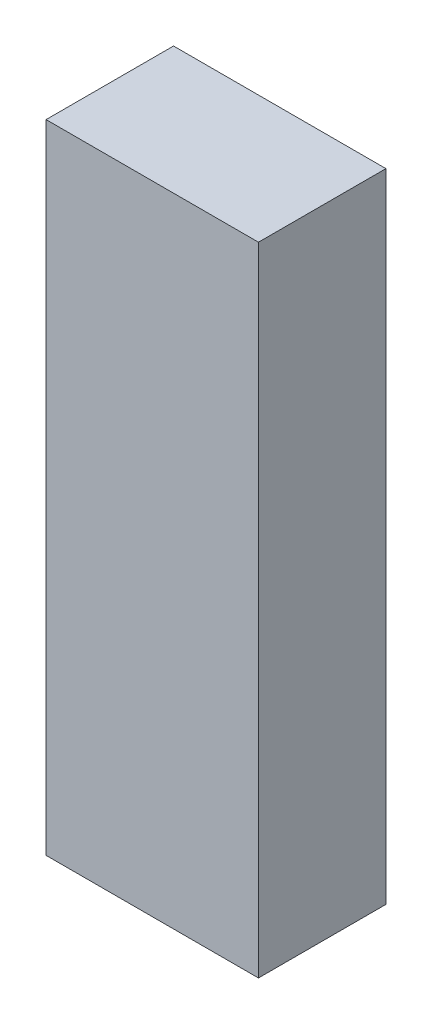
ISO-10303-21;
HEADER;
FILE_DESCRIPTION(('STEP AP214'),'2;1');
FILE_NAME('part.step','',(''),(''),'','','');
FILE_SCHEMA(('AUTOMOTIVE_DESIGN { 1 0 10303 214 1 1 1 1 }'));
ENDSEC;
DATA;
#1=APPLICATION_CONTEXT('core data for automotive mechanical design processes');
#2=APPLICATION_PROTOCOL_DEFINITION('international standard','automotive_design',2000,#1);
#3=PRODUCT_CONTEXT('',#1,'mechanical');
#4=PRODUCT('Part','Part','',(#3));
#5=PRODUCT_RELATED_PRODUCT_CATEGORY('part','',(#4));
#6=PRODUCT_DEFINITION_FORMATION('','',#4);
#7=PRODUCT_DEFINITION_CONTEXT('part definition',#1,'design');
#8=PRODUCT_DEFINITION('design','',#6,#7);
#9=PRODUCT_DEFINITION_SHAPE('','',#8);
#10=(LENGTH_UNIT() NAMED_UNIT(*) SI_UNIT(.MILLI.,.METRE.));
#11=(NAMED_UNIT(*) PLANE_ANGLE_UNIT() SI_UNIT($,.RADIAN.));
#12=(NAMED_UNIT(*) SI_UNIT($,.STERADIAN.) SOLID_ANGLE_UNIT());
#13=UNCERTAINTY_MEASURE_WITH_UNIT(LENGTH_MEASURE(1.E-05),#10,'distance_accuracy_value','');
#14=(GEOMETRIC_REPRESENTATION_CONTEXT(3) GLOBAL_UNCERTAINTY_ASSIGNED_CONTEXT((#13)) GLOBAL_UNIT_ASSIGNED_CONTEXT((#10,
#11,#12)) REPRESENTATION_CONTEXT('',''));
#15=CARTESIAN_POINT('',(0.,0.,0.));
#16=DIRECTION('',(0.,0.,1.));
#17=DIRECTION('',(1.,0.,0.));
#18=AXIS2_PLACEMENT_3D('',#15,#16,#17);
#19=CARTESIAN_POINT('',(2.49949208,-7.4994897,3.));
#20=DIRECTION('',(0.,0.,-1.));
#21=DIRECTION('',(-1.,0.,0.));
#22=AXIS2_PLACEMENT_3D('',#19,#20,#21);
#23=PLANE('',#22);
#24=DIRECTION('',(1.,0.,0.));
#25=VECTOR('',#24,1.);
#26=CARTESIAN_POINT('',(2.49949208,7.49949224,3.));
#27=LINE('',#26,#25);
#28=CARTESIAN_POINT('',(2.49949208,7.49949224,3.));
#29=VERTEX_POINT('',#28);
#30=CARTESIAN_POINT('',(-2.49949208,7.49949224,3.));
#31=VERTEX_POINT('',#30);
#32=EDGE_CURVE('E79',#29,#31,#27,.F.);
#33=ORIENTED_EDGE('',*,*,#32,.T.);
#34=DIRECTION('',(0.,1.,0.));
#35=VECTOR('',#34,1.);
#36=CARTESIAN_POINT('',(-2.49949208,7.49949224,3.));
#37=LINE('',#36,#35);
#38=CARTESIAN_POINT('',(-2.49949208,-7.4994897,3.));
#39=VERTEX_POINT('',#38);
#40=EDGE_CURVE('E55',#31,#39,#37,.F.);
#41=ORIENTED_EDGE('',*,*,#40,.T.);
#42=DIRECTION('',(1.,0.,0.));
#43=VECTOR('',#42,1.);
#44=CARTESIAN_POINT('',(-2.49949208,-7.4994897,3.));
#45=LINE('',#44,#43);
#46=CARTESIAN_POINT('',(2.49949208,-7.4994897,3.));
#47=VERTEX_POINT('',#46);
#48=EDGE_CURVE('E57',#39,#47,#45,.T.);
#49=ORIENTED_EDGE('',*,*,#48,.T.);
#50=DIRECTION('',(0.,1.,0.));
#51=VECTOR('',#50,1.);
#52=CARTESIAN_POINT('',(2.49949208,-7.4994897,3.));
#53=LINE('',#52,#51);
#54=EDGE_CURVE('E20',#47,#29,#53,.T.);
#55=ORIENTED_EDGE('',*,*,#54,.T.);
#56=EDGE_LOOP('',(#33,#41,#49,#55));
#57=FACE_BOUND('',#56,.T.);
#58=ADVANCED_FACE('F17',(#57),#23,.F.);
#59=CARTESIAN_POINT('',(2.49949208,-7.4994897,0.));
#60=DIRECTION('',(-1.,0.,0.));
#61=DIRECTION('',(0.,0.,1.));
#62=AXIS2_PLACEMENT_3D('',#59,#60,#61);
#63=PLANE('',#62);
#64=DIRECTION('',(0.,1.,0.));
#65=VECTOR('',#64,1.);
#66=CARTESIAN_POINT('',(2.49949208,-7.4994897,0.));
#67=LINE('',#66,#65);
#68=CARTESIAN_POINT('',(2.49949208,7.49949224,0.));
#69=VERTEX_POINT('',#68);
#70=CARTESIAN_POINT('',(2.49949208,-7.4994897,0.));
#71=VERTEX_POINT('',#70);
#72=EDGE_CURVE('E83',#69,#71,#67,.F.);
#73=ORIENTED_EDGE('',*,*,#72,.F.);
#74=DIRECTION('',(0.,0.,-1.));
#75=VECTOR('',#74,1.);
#76=CARTESIAN_POINT('',(2.49949208,7.49949224,0.));
#77=LINE('',#76,#75);
#78=EDGE_CURVE('E68',#69,#29,#77,.F.);
#79=ORIENTED_EDGE('',*,*,#78,.T.);
#80=ORIENTED_EDGE('',*,*,#54,.F.);
#81=DIRECTION('',(0.,0.,1.));
#82=VECTOR('',#81,1.);
#83=CARTESIAN_POINT('',(2.49949208,-7.4994897,0.));
#84=LINE('',#83,#82);
#85=EDGE_CURVE('E63',#47,#71,#84,.F.);
#86=ORIENTED_EDGE('',*,*,#85,.T.);
#87=EDGE_LOOP('',(#73,#79,#80,#86));
#88=FACE_BOUND('',#87,.T.);
#89=ADVANCED_FACE('F65',(#88),#63,.F.);
#90=CARTESIAN_POINT('',(-2.49949208,-7.4994897,0.));
#91=DIRECTION('',(0.,1.,0.));
#92=DIRECTION('',(0.,0.,1.));
#93=AXIS2_PLACEMENT_3D('',#90,#91,#92);
#94=PLANE('',#93);
#95=DIRECTION('',(-1.,0.,0.));
#96=VECTOR('',#95,1.);
#97=CARTESIAN_POINT('',(2.49949208,-7.4994897,0.));
#98=LINE('',#97,#96);
#99=CARTESIAN_POINT('',(-2.49949208,-7.4994897,0.));
#100=VERTEX_POINT('',#99);
#101=EDGE_CURVE('E72',#71,#100,#98,.T.);
#102=ORIENTED_EDGE('',*,*,#101,.F.);
#103=ORIENTED_EDGE('',*,*,#85,.F.);
#104=ORIENTED_EDGE('',*,*,#48,.F.);
#105=DIRECTION('',(0.,0.,-1.));
#106=VECTOR('',#105,1.);
#107=CARTESIAN_POINT('',(-2.49949208,-7.4994897,0.));
#108=LINE('',#107,#106);
#109=EDGE_CURVE('E75',#39,#100,#108,.T.);
#110=ORIENTED_EDGE('',*,*,#109,.T.);
#111=EDGE_LOOP('',(#102,#103,#104,#110));
#112=FACE_BOUND('',#111,.T.);
#113=ADVANCED_FACE('F70',(#112),#94,.F.);
#114=CARTESIAN_POINT('',(-2.49949208,7.49949224,0.));
#115=DIRECTION('',(1.,0.,0.));
#116=DIRECTION('',(0.,0.,-1.));
#117=AXIS2_PLACEMENT_3D('',#114,#115,#116);
#118=PLANE('',#117);
#119=DIRECTION('',(0.,1.,0.));
#120=VECTOR('',#119,1.);
#121=CARTESIAN_POINT('',(-2.49949208,-7.4994897,0.));
#122=LINE('',#121,#120);
#123=CARTESIAN_POINT('',(-2.49949208,7.49949224,0.));
#124=VERTEX_POINT('',#123);
#125=EDGE_CURVE('E26',#100,#124,#122,.T.);
#126=ORIENTED_EDGE('',*,*,#125,.F.);
#127=ORIENTED_EDGE('',*,*,#109,.F.);
#128=ORIENTED_EDGE('',*,*,#40,.F.);
#129=DIRECTION('',(0.,0.,-1.));
#130=VECTOR('',#129,1.);
#131=CARTESIAN_POINT('',(-2.49949208,7.49949224,0.));
#132=LINE('',#131,#130);
#133=EDGE_CURVE('E35',#31,#124,#132,.T.);
#134=ORIENTED_EDGE('',*,*,#133,.T.);
#135=EDGE_LOOP('',(#126,#127,#128,#134));
#136=FACE_BOUND('',#135,.T.);
#137=ADVANCED_FACE('F89',(#136),#118,.F.);
#138=CARTESIAN_POINT('',(2.49949208,7.49949224,0.));
#139=DIRECTION('',(0.,-1.,0.));
#140=DIRECTION('',(0.,0.,-1.));
#141=AXIS2_PLACEMENT_3D('',#138,#139,#140);
#142=PLANE('',#141);
#143=DIRECTION('',(-1.,0.,0.));
#144=VECTOR('',#143,1.);
#145=CARTESIAN_POINT('',(2.49949208,7.49949224,0.));
#146=LINE('',#145,#144);
#147=EDGE_CURVE('E11',#124,#69,#146,.F.);
#148=ORIENTED_EDGE('',*,*,#147,.F.);
#149=ORIENTED_EDGE('',*,*,#133,.F.);
#150=ORIENTED_EDGE('',*,*,#32,.F.);
#151=ORIENTED_EDGE('',*,*,#78,.F.);
#152=EDGE_LOOP('',(#148,#149,#150,#151));
#153=FACE_BOUND('',#152,.T.);
#154=ADVANCED_FACE('F91',(#153),#142,.F.);
#155=CARTESIAN_POINT('',(2.49949208,-7.4994897,0.));
#156=DIRECTION('',(0.,0.,-1.));
#157=DIRECTION('',(-1.,0.,0.));
#158=AXIS2_PLACEMENT_3D('',#155,#156,#157);
#159=PLANE('',#158);
#160=ORIENTED_EDGE('',*,*,#125,.T.);
#161=ORIENTED_EDGE('',*,*,#147,.T.);
#162=ORIENTED_EDGE('',*,*,#72,.T.);
#163=ORIENTED_EDGE('',*,*,#101,.T.);
#164=EDGE_LOOP('',(#160,#161,#162,#163));
#165=FACE_BOUND('',#164,.T.);
#166=ADVANCED_FACE('F88',(#165),#159,.T.);
#167=CLOSED_SHELL('',(#58,#89,#113,#137,#154,#166));
#168=MANIFOLD_SOLID_BREP('B1',#167);
#169=ADVANCED_BREP_SHAPE_REPRESENTATION('',(#18,#168),#14);
#170=SHAPE_DEFINITION_REPRESENTATION(#9,#169);
ENDSEC;
END-ISO-10303-21;
